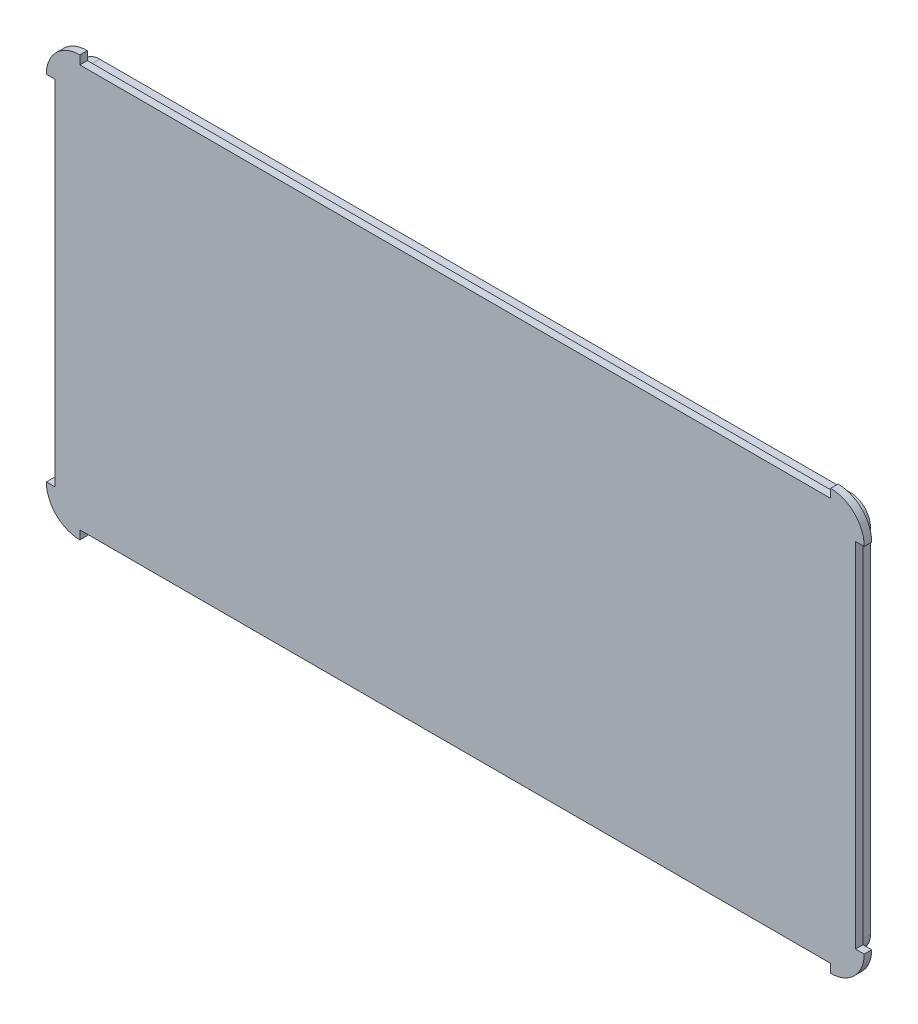
ISO-10303-21;
HEADER;
FILE_DESCRIPTION(('STEP AP214'),'2;1');
FILE_NAME('part.step','',(''),(''),'','','');
FILE_SCHEMA(('AUTOMOTIVE_DESIGN { 1 0 10303 214 1 1 1 1 }'));
ENDSEC;
DATA;
#1=APPLICATION_CONTEXT('core data for automotive mechanical design processes');
#2=APPLICATION_PROTOCOL_DEFINITION('international standard','automotive_design',2000,#1);
#3=PRODUCT_CONTEXT('',#1,'mechanical');
#4=PRODUCT('Part','Part','',(#3));
#5=PRODUCT_RELATED_PRODUCT_CATEGORY('part','',(#4));
#6=PRODUCT_DEFINITION_FORMATION('','',#4);
#7=PRODUCT_DEFINITION_CONTEXT('part definition',#1,'design');
#8=PRODUCT_DEFINITION('design','',#6,#7);
#9=PRODUCT_DEFINITION_SHAPE('','',#8);
#10=(LENGTH_UNIT() NAMED_UNIT(*) SI_UNIT(.MILLI.,.METRE.));
#11=(NAMED_UNIT(*) PLANE_ANGLE_UNIT() SI_UNIT($,.RADIAN.));
#12=(NAMED_UNIT(*) SI_UNIT($,.STERADIAN.) SOLID_ANGLE_UNIT());
#13=UNCERTAINTY_MEASURE_WITH_UNIT(LENGTH_MEASURE(1.E-05),#10,'distance_accuracy_value','');
#14=(GEOMETRIC_REPRESENTATION_CONTEXT(3) GLOBAL_UNCERTAINTY_ASSIGNED_CONTEXT((#13)) GLOBAL_UNIT_ASSIGNED_CONTEXT((#10,
#11,#12)) REPRESENTATION_CONTEXT('',''));
#15=CARTESIAN_POINT('',(0.,0.,0.));
#16=DIRECTION('',(0.,0.,1.));
#17=DIRECTION('',(1.,0.,0.));
#18=AXIS2_PLACEMENT_3D('',#15,#16,#17);
#19=CARTESIAN_POINT('',(151.,-71.,-3.));
#20=DIRECTION('',(0.,0.,1.));
#21=DIRECTION('',(1.,0.,0.));
#22=AXIS2_PLACEMENT_3D('',#19,#20,#21);
#23=PLANE('',#22);
#24=DIRECTION('',(1.,0.,0.));
#25=VECTOR('',#24,1.);
#26=CARTESIAN_POINT('',(-164.5,-70.9999999999999,-3.));
#27=LINE('',#26,#25);
#28=CARTESIAN_POINT('',(-164.5,-70.9999999999999,-3.));
#29=VERTEX_POINT('',#28);
#30=CARTESIAN_POINT('',(-161.,-70.9999999999999,-3.));
#31=VERTEX_POINT('',#30);
#32=EDGE_CURVE('E213',#29,#31,#27,.T.);
#33=ORIENTED_EDGE('',*,*,#32,.T.);
#34=DIRECTION('',(0.,-1.,0.));
#35=VECTOR('',#34,1.);
#36=CARTESIAN_POINT('',(-161.,70.9999999999999,-3.));
#37=LINE('',#36,#35);
#38=CARTESIAN_POINT('',(-161.,70.9999999999999,-3.));
#39=VERTEX_POINT('',#38);
#40=EDGE_CURVE('E356',#39,#31,#37,.T.);
#41=ORIENTED_EDGE('',*,*,#40,.F.);
#42=DIRECTION('',(-1.,0.,0.));
#43=VECTOR('',#42,1.);
#44=CARTESIAN_POINT('',(-164.5,70.9999999999999,-3.));
#45=LINE('',#44,#43);
#46=CARTESIAN_POINT('',(-164.5,70.9999999999999,-3.));
#47=VERTEX_POINT('',#46);
#48=EDGE_CURVE('E276',#39,#47,#45,.T.);
#49=ORIENTED_EDGE('',*,*,#48,.T.);
#50=CARTESIAN_POINT('',(-151.,71.,-3.));
#51=DIRECTION('',(0.,0.,1.));
#52=DIRECTION('',(1.,0.,0.));
#53=AXIS2_PLACEMENT_3D('',#50,#51,#52);
#54=CIRCLE('',#53,13.5000000000001);
#55=CARTESIAN_POINT('',(-151.,84.5,-3.));
#56=VERTEX_POINT('',#55);
#57=EDGE_CURVE('E273',#47,#56,#54,.F.);
#58=ORIENTED_EDGE('',*,*,#57,.T.);
#59=DIRECTION('',(0.,-1.,0.));
#60=VECTOR('',#59,1.);
#61=CARTESIAN_POINT('',(-151.,84.5,-3.));
#62=LINE('',#61,#60);
#63=CARTESIAN_POINT('',(-151.,81.,-3.));
#64=VERTEX_POINT('',#63);
#65=EDGE_CURVE('E270',#56,#64,#62,.T.);
#66=ORIENTED_EDGE('',*,*,#65,.T.);
#67=DIRECTION('',(-1.,0.,0.));
#68=VECTOR('',#67,1.);
#69=CARTESIAN_POINT('',(-151.,81.,-3.));
#70=LINE('',#69,#68);
#71=CARTESIAN_POINT('',(151.,81.,-3.));
#72=VERTEX_POINT('',#71);
#73=EDGE_CURVE('E352',#72,#64,#70,.T.);
#74=ORIENTED_EDGE('',*,*,#73,.F.);
#75=DIRECTION('',(0.,1.,0.));
#76=VECTOR('',#75,1.);
#77=CARTESIAN_POINT('',(151.,84.5,-3.));
#78=LINE('',#77,#76);
#79=CARTESIAN_POINT('',(151.,84.5,-3.));
#80=VERTEX_POINT('',#79);
#81=EDGE_CURVE('E250',#72,#80,#78,.T.);
#82=ORIENTED_EDGE('',*,*,#81,.T.);
#83=CARTESIAN_POINT('',(151.,71.,-3.));
#84=DIRECTION('',(0.,0.,1.));
#85=DIRECTION('',(1.,0.,0.));
#86=AXIS2_PLACEMENT_3D('',#83,#84,#85);
#87=CIRCLE('',#86,13.5000000000001);
#88=CARTESIAN_POINT('',(164.5,71.,-3.));
#89=VERTEX_POINT('',#88);
#90=EDGE_CURVE('E256',#80,#89,#87,.F.);
#91=ORIENTED_EDGE('',*,*,#90,.T.);
#92=DIRECTION('',(-1.,0.,0.));
#93=VECTOR('',#92,1.);
#94=CARTESIAN_POINT('',(164.5,71.,-3.));
#95=LINE('',#94,#93);
#96=CARTESIAN_POINT('',(161.,71.,-3.));
#97=VERTEX_POINT('',#96);
#98=EDGE_CURVE('E252',#89,#97,#95,.T.);
#99=ORIENTED_EDGE('',*,*,#98,.T.);
#100=DIRECTION('',(0.,1.,0.));
#101=VECTOR('',#100,1.);
#102=CARTESIAN_POINT('',(161.,71.,-3.));
#103=LINE('',#102,#101);
#104=CARTESIAN_POINT('',(161.,-71.,-3.));
#105=VERTEX_POINT('',#104);
#106=EDGE_CURVE('E349',#105,#97,#103,.T.);
#107=ORIENTED_EDGE('',*,*,#106,.F.);
#108=DIRECTION('',(1.,0.,0.));
#109=VECTOR('',#108,1.);
#110=CARTESIAN_POINT('',(164.5,-71.,-3.));
#111=LINE('',#110,#109);
#112=CARTESIAN_POINT('',(164.5,-71.,-3.));
#113=VERTEX_POINT('',#112);
#114=EDGE_CURVE('E230',#105,#113,#111,.T.);
#115=ORIENTED_EDGE('',*,*,#114,.T.);
#116=CARTESIAN_POINT('',(151.,-71.,-3.));
#117=DIRECTION('',(0.,0.,1.));
#118=DIRECTION('',(1.,0.,0.));
#119=AXIS2_PLACEMENT_3D('',#116,#117,#118);
#120=CIRCLE('',#119,13.5000000000001);
#121=CARTESIAN_POINT('',(151.,-84.5000000000001,-3.));
#122=VERTEX_POINT('',#121);
#123=EDGE_CURVE('E236',#113,#122,#120,.F.);
#124=ORIENTED_EDGE('',*,*,#123,.T.);
#125=DIRECTION('',(0.,1.,0.));
#126=VECTOR('',#125,1.);
#127=CARTESIAN_POINT('',(151.,-84.5,-3.));
#128=LINE('',#127,#126);
#129=CARTESIAN_POINT('',(151.,-81.0000000000001,-3.));
#130=VERTEX_POINT('',#129);
#131=EDGE_CURVE('E232',#122,#130,#128,.T.);
#132=ORIENTED_EDGE('',*,*,#131,.T.);
#133=DIRECTION('',(1.,0.,0.));
#134=VECTOR('',#133,1.);
#135=CARTESIAN_POINT('',(-151.,-81.,-3.));
#136=LINE('',#135,#134);
#137=CARTESIAN_POINT('',(-151.,-81.,-3.));
#138=VERTEX_POINT('',#137);
#139=EDGE_CURVE('E359',#138,#130,#136,.T.);
#140=ORIENTED_EDGE('',*,*,#139,.F.);
#141=DIRECTION('',(0.,-1.,0.));
#142=VECTOR('',#141,1.);
#143=CARTESIAN_POINT('',(-151.,-84.5,-3.));
#144=LINE('',#143,#142);
#145=CARTESIAN_POINT('',(-151.,-84.5,-3.));
#146=VERTEX_POINT('',#145);
#147=EDGE_CURVE('E225',#138,#146,#144,.T.);
#148=ORIENTED_EDGE('',*,*,#147,.T.);
#149=CARTESIAN_POINT('',(-151.,-71.,-3.));
#150=DIRECTION('',(0.,0.,1.));
#151=DIRECTION('',(1.,0.,0.));
#152=AXIS2_PLACEMENT_3D('',#149,#150,#151);
#153=CIRCLE('',#152,13.5000000000001);
#154=EDGE_CURVE('E227',#146,#29,#153,.F.);
#155=ORIENTED_EDGE('',*,*,#154,.T.);
#156=EDGE_LOOP('',(#33,#41,#49,#58,#66,#74,#82,#91,#99,#107,#115,#124,#132,#140,#148,#155));
#157=FACE_BOUND('',#156,.T.);
#158=DIRECTION('',(0.,1.,0.));
#159=VECTOR('',#158,1.);
#160=CARTESIAN_POINT('',(-159.,-71.,-3.));
#161=LINE('',#160,#159);
#162=CARTESIAN_POINT('',(-159.,-71.,-3.));
#163=VERTEX_POINT('',#162);
#164=CARTESIAN_POINT('',(-159.,70.9999999999999,-3.));
#165=VERTEX_POINT('',#164);
#166=EDGE_CURVE('E307',#163,#165,#161,.T.);
#167=ORIENTED_EDGE('',*,*,#166,.F.);
#168=CARTESIAN_POINT('',(-151.,-71.,-3.));
#169=DIRECTION('',(0.,0.,-1.));
#170=DIRECTION('',(-1.,0.,0.));
#171=AXIS2_PLACEMENT_3D('',#168,#169,#170);
#172=CIRCLE('',#171,8.00000000000001);
#173=CARTESIAN_POINT('',(-151.,-79.,-3.));
#174=VERTEX_POINT('',#173);
#175=EDGE_CURVE('E52',#174,#163,#172,.T.);
#176=ORIENTED_EDGE('',*,*,#175,.F.);
#177=DIRECTION('',(-1.,0.,0.));
#178=VECTOR('',#177,1.);
#179=CARTESIAN_POINT('',(151.,-79.,-3.));
#180=LINE('',#179,#178);
#181=CARTESIAN_POINT('',(151.,-79.,-3.));
#182=VERTEX_POINT('',#181);
#183=EDGE_CURVE('E56',#182,#174,#180,.T.);
#184=ORIENTED_EDGE('',*,*,#183,.F.);
#185=CARTESIAN_POINT('',(151.,-71.,-3.));
#186=DIRECTION('',(0.,0.,-1.));
#187=DIRECTION('',(-1.,0.,0.));
#188=AXIS2_PLACEMENT_3D('',#185,#186,#187);
#189=CIRCLE('',#188,8.00000000000006);
#190=CARTESIAN_POINT('',(159.,-71.,-3.));
#191=VERTEX_POINT('',#190);
#192=EDGE_CURVE('E322',#191,#182,#189,.T.);
#193=ORIENTED_EDGE('',*,*,#192,.F.);
#194=DIRECTION('',(0.,-1.,0.));
#195=VECTOR('',#194,1.);
#196=CARTESIAN_POINT('',(159.,71.,-3.));
#197=LINE('',#196,#195);
#198=CARTESIAN_POINT('',(159.,71.,-3.));
#199=VERTEX_POINT('',#198);
#200=EDGE_CURVE('E319',#199,#191,#197,.T.);
#201=ORIENTED_EDGE('',*,*,#200,.F.);
#202=CARTESIAN_POINT('',(151.,71.,-3.));
#203=DIRECTION('',(0.,0.,-1.));
#204=DIRECTION('',(-1.,0.,0.));
#205=AXIS2_PLACEMENT_3D('',#202,#203,#204);
#206=CIRCLE('',#205,8.0000000000001);
#207=CARTESIAN_POINT('',(151.,79.0000000000001,-3.));
#208=VERTEX_POINT('',#207);
#209=EDGE_CURVE('E316',#208,#199,#206,.T.);
#210=ORIENTED_EDGE('',*,*,#209,.F.);
#211=DIRECTION('',(1.,0.,0.));
#212=VECTOR('',#211,1.);
#213=CARTESIAN_POINT('',(-151.,79.,-3.));
#214=LINE('',#213,#212);
#215=CARTESIAN_POINT('',(-151.,79.,-3.));
#216=VERTEX_POINT('',#215);
#217=EDGE_CURVE('E313',#216,#208,#214,.T.);
#218=ORIENTED_EDGE('',*,*,#217,.F.);
#219=CARTESIAN_POINT('',(-151.,70.9999999999999,-3.));
#220=DIRECTION('',(0.,0.,-1.));
#221=DIRECTION('',(-1.,0.,0.));
#222=AXIS2_PLACEMENT_3D('',#219,#220,#221);
#223=CIRCLE('',#222,8.00000000000002);
#224=EDGE_CURVE('E310',#165,#216,#223,.T.);
#225=ORIENTED_EDGE('',*,*,#224,.F.);
#226=EDGE_LOOP('',(#167,#176,#184,#193,#201,#210,#218,#225));
#227=FACE_BOUND('',#226,.T.);
#228=ADVANCED_FACE('F35',(#157,#227),#23,.F.);
#229=CARTESIAN_POINT('',(-151.,-81.,-3.));
#230=DIRECTION('',(0.,-1.,0.));
#231=DIRECTION('',(1.,0.,0.));
#232=AXIS2_PLACEMENT_3D('',#229,#230,#231);
#233=PLANE('',#232);
#234=DIRECTION('',(1.,0.,0.));
#235=VECTOR('',#234,1.);
#236=CARTESIAN_POINT('',(-151.,-81.,0.));
#237=LINE('',#236,#235);
#238=CARTESIAN_POINT('',(-151.,-81.,0.));
#239=VERTEX_POINT('',#238);
#240=CARTESIAN_POINT('',(151.,-81.0000000000001,0.));
#241=VERTEX_POINT('',#240);
#242=EDGE_CURVE('E353',#239,#241,#237,.T.);
#243=ORIENTED_EDGE('',*,*,#242,.F.);
#244=DIRECTION('',(0.,0.,1.));
#245=VECTOR('',#244,1.);
#246=CARTESIAN_POINT('',(-151.,-81.,-3.));
#247=LINE('',#246,#245);
#248=EDGE_CURVE('E44',#138,#239,#247,.T.);
#249=ORIENTED_EDGE('',*,*,#248,.F.);
#250=ORIENTED_EDGE('',*,*,#139,.T.);
#251=DIRECTION('',(0.,0.,1.));
#252=VECTOR('',#251,1.);
#253=CARTESIAN_POINT('',(151.,-81.0000000000001,-3.));
#254=LINE('',#253,#252);
#255=EDGE_CURVE('E11',#130,#241,#254,.T.);
#256=ORIENTED_EDGE('',*,*,#255,.T.);
#257=EDGE_LOOP('',(#243,#249,#250,#256));
#258=FACE_BOUND('',#257,.T.);
#259=ADVANCED_FACE('F402',(#258),#233,.T.);
#260=CARTESIAN_POINT('',(-161.,70.9999999999999,-3.));
#261=DIRECTION('',(-1.,0.,0.));
#262=DIRECTION('',(0.,-1.,0.));
#263=AXIS2_PLACEMENT_3D('',#260,#261,#262);
#264=PLANE('',#263);
#265=DIRECTION('',(0.,-1.,0.));
#266=VECTOR('',#265,1.);
#267=CARTESIAN_POINT('',(-161.,70.9999999999999,0.));
#268=LINE('',#267,#266);
#269=CARTESIAN_POINT('',(-161.,70.9999999999999,0.));
#270=VERTEX_POINT('',#269);
#271=CARTESIAN_POINT('',(-161.,-71.,0.));
#272=VERTEX_POINT('',#271);
#273=EDGE_CURVE('E204',#270,#272,#268,.T.);
#274=ORIENTED_EDGE('',*,*,#273,.F.);
#275=DIRECTION('',(0.,0.,1.));
#276=VECTOR('',#275,1.);
#277=CARTESIAN_POINT('',(-161.,70.9999999999999,-3.));
#278=LINE('',#277,#276);
#279=EDGE_CURVE('E372',#39,#270,#278,.T.);
#280=ORIENTED_EDGE('',*,*,#279,.F.);
#281=ORIENTED_EDGE('',*,*,#40,.T.);
#282=DIRECTION('',(0.,0.,1.));
#283=VECTOR('',#282,1.);
#284=CARTESIAN_POINT('',(-161.,-71.,-3.));
#285=LINE('',#284,#283);
#286=EDGE_CURVE('E370',#31,#272,#285,.T.);
#287=ORIENTED_EDGE('',*,*,#286,.T.);
#288=EDGE_LOOP('',(#274,#280,#281,#287));
#289=FACE_BOUND('',#288,.T.);
#290=ADVANCED_FACE('F410',(#289),#264,.T.);
#291=CARTESIAN_POINT('',(-151.,81.,-3.));
#292=DIRECTION('',(0.,1.,0.));
#293=DIRECTION('',(-1.,0.,0.));
#294=AXIS2_PLACEMENT_3D('',#291,#292,#293);
#295=PLANE('',#294);
#296=DIRECTION('',(-1.,0.,0.));
#297=VECTOR('',#296,1.);
#298=CARTESIAN_POINT('',(-151.,81.,0.));
#299=LINE('',#298,#297);
#300=CARTESIAN_POINT('',(151.,81.,0.));
#301=VERTEX_POINT('',#300);
#302=CARTESIAN_POINT('',(-151.,81.,0.));
#303=VERTEX_POINT('',#302);
#304=EDGE_CURVE('E363',#301,#303,#299,.T.);
#305=ORIENTED_EDGE('',*,*,#304,.F.);
#306=DIRECTION('',(0.,0.,1.));
#307=VECTOR('',#306,1.);
#308=CARTESIAN_POINT('',(151.,81.0000000000001,-3.));
#309=LINE('',#308,#307);
#310=EDGE_CURVE('E377',#72,#301,#309,.T.);
#311=ORIENTED_EDGE('',*,*,#310,.F.);
#312=ORIENTED_EDGE('',*,*,#73,.T.);
#313=DIRECTION('',(0.,0.,1.));
#314=VECTOR('',#313,1.);
#315=CARTESIAN_POINT('',(-151.,81.,-3.));
#316=LINE('',#315,#314);
#317=EDGE_CURVE('E374',#64,#303,#316,.T.);
#318=ORIENTED_EDGE('',*,*,#317,.T.);
#319=EDGE_LOOP('',(#305,#311,#312,#318));
#320=FACE_BOUND('',#319,.T.);
#321=ADVANCED_FACE('F426',(#320),#295,.T.);
#322=CARTESIAN_POINT('',(161.,71.,-3.));
#323=DIRECTION('',(1.,0.,0.));
#324=DIRECTION('',(0.,0.,-1.));
#325=AXIS2_PLACEMENT_3D('',#322,#323,#324);
#326=PLANE('',#325);
#327=DIRECTION('',(0.,1.,0.));
#328=VECTOR('',#327,1.);
#329=CARTESIAN_POINT('',(161.,71.,0.));
#330=LINE('',#329,#328);
#331=CARTESIAN_POINT('',(161.,-71.,0.));
#332=VERTEX_POINT('',#331);
#333=CARTESIAN_POINT('',(161.,71.,0.));
#334=VERTEX_POINT('',#333);
#335=EDGE_CURVE('E348',#332,#334,#330,.T.);
#336=ORIENTED_EDGE('',*,*,#335,.F.);
#337=DIRECTION('',(0.,0.,1.));
#338=VECTOR('',#337,1.);
#339=CARTESIAN_POINT('',(161.,-71.,-3.));
#340=LINE('',#339,#338);
#341=EDGE_CURVE('E39',#105,#332,#340,.T.);
#342=ORIENTED_EDGE('',*,*,#341,.F.);
#343=ORIENTED_EDGE('',*,*,#106,.T.);
#344=DIRECTION('',(0.,0.,1.));
#345=VECTOR('',#344,1.);
#346=CARTESIAN_POINT('',(161.,71.,-3.));
#347=LINE('',#346,#345);
#348=EDGE_CURVE('E378',#97,#334,#347,.T.);
#349=ORIENTED_EDGE('',*,*,#348,.T.);
#350=EDGE_LOOP('',(#336,#342,#343,#349));
#351=FACE_BOUND('',#350,.T.);
#352=ADVANCED_FACE('F37',(#351),#326,.T.);
#353=CARTESIAN_POINT('',(151.,-71.,0.));
#354=DIRECTION('',(0.,0.,1.));
#355=DIRECTION('',(1.,0.,0.));
#356=AXIS2_PLACEMENT_3D('',#353,#354,#355);
#357=PLANE('',#356);
#358=ORIENTED_EDGE('',*,*,#273,.T.);
#359=DIRECTION('',(-1.,0.,0.));
#360=VECTOR('',#359,1.);
#361=CARTESIAN_POINT('',(-164.5,-70.9999999999999,0.));
#362=LINE('',#361,#360);
#363=CARTESIAN_POINT('',(-164.5,-70.9999999999999,0.));
#364=VERTEX_POINT('',#363);
#365=EDGE_CURVE('E195',#272,#364,#362,.T.);
#366=ORIENTED_EDGE('',*,*,#365,.T.);
#367=CARTESIAN_POINT('',(-151.,-71.,0.));
#368=DIRECTION('',(0.,0.,1.));
#369=DIRECTION('',(1.,0.,0.));
#370=AXIS2_PLACEMENT_3D('',#367,#368,#369);
#371=CIRCLE('',#370,13.5000000000001);
#372=CARTESIAN_POINT('',(-151.,-84.5,0.));
#373=VERTEX_POINT('',#372);
#374=EDGE_CURVE('E200',#364,#373,#371,.T.);
#375=ORIENTED_EDGE('',*,*,#374,.T.);
#376=DIRECTION('',(0.,1.,0.));
#377=VECTOR('',#376,1.);
#378=CARTESIAN_POINT('',(-151.,-84.5,0.));
#379=LINE('',#378,#377);
#380=EDGE_CURVE('E217',#373,#239,#379,.T.);
#381=ORIENTED_EDGE('',*,*,#380,.T.);
#382=ORIENTED_EDGE('',*,*,#242,.T.);
#383=DIRECTION('',(0.,-1.,0.));
#384=VECTOR('',#383,1.);
#385=CARTESIAN_POINT('',(151.,-84.5,0.));
#386=LINE('',#385,#384);
#387=CARTESIAN_POINT('',(151.,-84.5000000000001,0.));
#388=VERTEX_POINT('',#387);
#389=EDGE_CURVE('E229',#241,#388,#386,.T.);
#390=ORIENTED_EDGE('',*,*,#389,.T.);
#391=CARTESIAN_POINT('',(151.,-71.,0.));
#392=DIRECTION('',(0.,0.,1.));
#393=DIRECTION('',(-1.,0.,0.));
#394=AXIS2_PLACEMENT_3D('',#391,#392,#393);
#395=CIRCLE('',#394,13.5000000000001);
#396=CARTESIAN_POINT('',(164.5,-71.,0.));
#397=VERTEX_POINT('',#396);
#398=EDGE_CURVE('E238',#388,#397,#395,.T.);
#399=ORIENTED_EDGE('',*,*,#398,.T.);
#400=DIRECTION('',(-1.,0.,0.));
#401=VECTOR('',#400,1.);
#402=CARTESIAN_POINT('',(164.5,-71.,0.));
#403=LINE('',#402,#401);
#404=EDGE_CURVE('E241',#397,#332,#403,.T.);
#405=ORIENTED_EDGE('',*,*,#404,.T.);
#406=ORIENTED_EDGE('',*,*,#335,.T.);
#407=DIRECTION('',(1.,0.,0.));
#408=VECTOR('',#407,1.);
#409=CARTESIAN_POINT('',(164.5,71.,0.));
#410=LINE('',#409,#408);
#411=CARTESIAN_POINT('',(164.5,71.,0.));
#412=VERTEX_POINT('',#411);
#413=EDGE_CURVE('E249',#334,#412,#410,.T.);
#414=ORIENTED_EDGE('',*,*,#413,.T.);
#415=CARTESIAN_POINT('',(151.,71.,0.));
#416=DIRECTION('',(0.,0.,1.));
#417=DIRECTION('',(1.,0.,0.));
#418=AXIS2_PLACEMENT_3D('',#415,#416,#417);
#419=CIRCLE('',#418,13.5000000000001);
#420=CARTESIAN_POINT('',(151.,84.5,0.));
#421=VERTEX_POINT('',#420);
#422=EDGE_CURVE('E258',#412,#421,#419,.T.);
#423=ORIENTED_EDGE('',*,*,#422,.T.);
#424=DIRECTION('',(0.,-1.,0.));
#425=VECTOR('',#424,1.);
#426=CARTESIAN_POINT('',(151.,84.5,0.));
#427=LINE('',#426,#425);
#428=EDGE_CURVE('E261',#421,#301,#427,.T.);
#429=ORIENTED_EDGE('',*,*,#428,.T.);
#430=ORIENTED_EDGE('',*,*,#304,.T.);
#431=DIRECTION('',(0.,1.,0.));
#432=VECTOR('',#431,1.);
#433=CARTESIAN_POINT('',(-151.,84.5,0.));
#434=LINE('',#433,#432);
#435=CARTESIAN_POINT('',(-151.,84.5,0.));
#436=VERTEX_POINT('',#435);
#437=EDGE_CURVE('E281',#303,#436,#434,.T.);
#438=ORIENTED_EDGE('',*,*,#437,.T.);
#439=CARTESIAN_POINT('',(-151.,71.,0.));
#440=DIRECTION('',(0.,0.,1.));
#441=DIRECTION('',(-1.,0.,0.));
#442=AXIS2_PLACEMENT_3D('',#439,#440,#441);
#443=CIRCLE('',#442,13.5000000000001);
#444=CARTESIAN_POINT('',(-164.5,70.9999999999999,0.));
#445=VERTEX_POINT('',#444);
#446=EDGE_CURVE('E269',#436,#445,#443,.T.);
#447=ORIENTED_EDGE('',*,*,#446,.T.);
#448=DIRECTION('',(1.,0.,0.));
#449=VECTOR('',#448,1.);
#450=CARTESIAN_POINT('',(-164.5,70.9999999999999,0.));
#451=LINE('',#450,#449);
#452=EDGE_CURVE('E279',#445,#270,#451,.T.);
#453=ORIENTED_EDGE('',*,*,#452,.T.);
#454=EDGE_LOOP('',(#358,#366,#375,#381,#382,#390,#399,#405,#406,#414,#423,#429,#430,#438,#447,#453));
#455=FACE_BOUND('',#454,.T.);
#456=ADVANCED_FACE('F197',(#455),#357,.T.);
#457=CARTESIAN_POINT('',(-151.,-71.,-8.));
#458=DIRECTION('',(0.,0.,1.));
#459=DIRECTION('',(1.,0.,0.));
#460=AXIS2_PLACEMENT_3D('',#457,#458,#459);
#461=CYLINDRICAL_SURFACE('',#460,8.00000000000001);
#462=ORIENTED_EDGE('',*,*,#175,.T.);
#463=DIRECTION('',(0.,0.,1.));
#464=VECTOR('',#463,1.);
#465=CARTESIAN_POINT('',(-159.,-71.,-8.));
#466=LINE('',#465,#464);
#467=CARTESIAN_POINT('',(-159.,-71.,-8.));
#468=VERTEX_POINT('',#467);
#469=EDGE_CURVE('E345',#468,#163,#466,.T.);
#470=ORIENTED_EDGE('',*,*,#469,.F.);
#471=CARTESIAN_POINT('',(-151.,-71.,-8.));
#472=DIRECTION('',(0.,0.,-1.));
#473=DIRECTION('',(-1.,0.,0.));
#474=AXIS2_PLACEMENT_3D('',#471,#472,#473);
#475=CIRCLE('',#474,8.00000000000001);
#476=CARTESIAN_POINT('',(-151.,-79.,-8.));
#477=VERTEX_POINT('',#476);
#478=EDGE_CURVE('E288',#477,#468,#475,.T.);
#479=ORIENTED_EDGE('',*,*,#478,.F.);
#480=DIRECTION('',(0.,0.,1.));
#481=VECTOR('',#480,1.);
#482=CARTESIAN_POINT('',(-151.,-79.,-8.));
#483=LINE('',#482,#481);
#484=EDGE_CURVE('E305',#477,#174,#483,.T.);
#485=ORIENTED_EDGE('',*,*,#484,.T.);
#486=EDGE_LOOP('',(#462,#470,#479,#485));
#487=FACE_BOUND('',#486,.T.);
#488=ADVANCED_FACE('F459',(#487),#461,.T.);
#489=CARTESIAN_POINT('',(-159.,-71.,-8.));
#490=DIRECTION('',(1.,0.,0.));
#491=DIRECTION('',(0.,1.,0.));
#492=AXIS2_PLACEMENT_3D('',#489,#490,#491);
#493=PLANE('',#492);
#494=ORIENTED_EDGE('',*,*,#166,.T.);
#495=DIRECTION('',(0.,0.,1.));
#496=VECTOR('',#495,1.);
#497=CARTESIAN_POINT('',(-159.,70.9999999999999,-8.));
#498=LINE('',#497,#496);
#499=CARTESIAN_POINT('',(-159.,70.9999999999999,-8.));
#500=VERTEX_POINT('',#499);
#501=EDGE_CURVE('E342',#500,#165,#498,.T.);
#502=ORIENTED_EDGE('',*,*,#501,.F.);
#503=DIRECTION('',(0.,1.,0.));
#504=VECTOR('',#503,1.);
#505=CARTESIAN_POINT('',(-159.,-71.,-8.));
#506=LINE('',#505,#504);
#507=EDGE_CURVE('E291',#468,#500,#506,.T.);
#508=ORIENTED_EDGE('',*,*,#507,.F.);
#509=ORIENTED_EDGE('',*,*,#469,.T.);
#510=EDGE_LOOP('',(#494,#502,#508,#509));
#511=FACE_BOUND('',#510,.T.);
#512=ADVANCED_FACE('F592',(#511),#493,.F.);
#513=CARTESIAN_POINT('',(-151.,70.9999999999999,-8.));
#514=DIRECTION('',(0.,0.,1.));
#515=DIRECTION('',(1.,0.,0.));
#516=AXIS2_PLACEMENT_3D('',#513,#514,#515);
#517=CYLINDRICAL_SURFACE('',#516,8.00000000000002);
#518=ORIENTED_EDGE('',*,*,#224,.T.);
#519=DIRECTION('',(0.,0.,1.));
#520=VECTOR('',#519,1.);
#521=CARTESIAN_POINT('',(-151.,79.,-8.));
#522=LINE('',#521,#520);
#523=CARTESIAN_POINT('',(-151.,79.,-8.));
#524=VERTEX_POINT('',#523);
#525=EDGE_CURVE('E339',#524,#216,#522,.T.);
#526=ORIENTED_EDGE('',*,*,#525,.F.);
#527=CARTESIAN_POINT('',(-151.,70.9999999999999,-8.));
#528=DIRECTION('',(0.,0.,-1.));
#529=DIRECTION('',(-1.,0.,0.));
#530=AXIS2_PLACEMENT_3D('',#527,#528,#529);
#531=CIRCLE('',#530,8.00000000000002);
#532=EDGE_CURVE('E293',#500,#524,#531,.T.);
#533=ORIENTED_EDGE('',*,*,#532,.F.);
#534=ORIENTED_EDGE('',*,*,#501,.T.);
#535=EDGE_LOOP('',(#518,#526,#533,#534));
#536=FACE_BOUND('',#535,.T.);
#537=ADVANCED_FACE('F589',(#536),#517,.T.);
#538=CARTESIAN_POINT('',(-151.,79.,-8.));
#539=DIRECTION('',(0.,-1.,0.));
#540=DIRECTION('',(1.,0.,0.));
#541=AXIS2_PLACEMENT_3D('',#538,#539,#540);
#542=PLANE('',#541);
#543=ORIENTED_EDGE('',*,*,#217,.T.);
#544=DIRECTION('',(0.,0.,1.));
#545=VECTOR('',#544,1.);
#546=CARTESIAN_POINT('',(151.,79.0000000000001,-8.));
#547=LINE('',#546,#545);
#548=CARTESIAN_POINT('',(151.,79.0000000000001,-8.));
#549=VERTEX_POINT('',#548);
#550=EDGE_CURVE('E336',#549,#208,#547,.T.);
#551=ORIENTED_EDGE('',*,*,#550,.F.);
#552=DIRECTION('',(1.,0.,0.));
#553=VECTOR('',#552,1.);
#554=CARTESIAN_POINT('',(-151.,79.,-8.));
#555=LINE('',#554,#553);
#556=EDGE_CURVE('E295',#524,#549,#555,.T.);
#557=ORIENTED_EDGE('',*,*,#556,.F.);
#558=ORIENTED_EDGE('',*,*,#525,.T.);
#559=EDGE_LOOP('',(#543,#551,#557,#558));
#560=FACE_BOUND('',#559,.T.);
#561=ADVANCED_FACE('F585',(#560),#542,.F.);
#562=CARTESIAN_POINT('',(151.,71.,-8.));
#563=DIRECTION('',(0.,0.,1.));
#564=DIRECTION('',(1.,0.,0.));
#565=AXIS2_PLACEMENT_3D('',#562,#563,#564);
#566=CYLINDRICAL_SURFACE('',#565,8.0000000000001);
#567=ORIENTED_EDGE('',*,*,#209,.T.);
#568=DIRECTION('',(0.,0.,1.));
#569=VECTOR('',#568,1.);
#570=CARTESIAN_POINT('',(159.,71.,-8.));
#571=LINE('',#570,#569);
#572=CARTESIAN_POINT('',(159.,71.,-8.));
#573=VERTEX_POINT('',#572);
#574=EDGE_CURVE('E333',#573,#199,#571,.T.);
#575=ORIENTED_EDGE('',*,*,#574,.F.);
#576=CARTESIAN_POINT('',(151.,71.,-8.));
#577=DIRECTION('',(0.,0.,-1.));
#578=DIRECTION('',(-1.,0.,0.));
#579=AXIS2_PLACEMENT_3D('',#576,#577,#578);
#580=CIRCLE('',#579,8.0000000000001);
#581=EDGE_CURVE('E297',#549,#573,#580,.T.);
#582=ORIENTED_EDGE('',*,*,#581,.F.);
#583=ORIENTED_EDGE('',*,*,#550,.T.);
#584=EDGE_LOOP('',(#567,#575,#582,#583));
#585=FACE_BOUND('',#584,.T.);
#586=ADVANCED_FACE('F581',(#585),#566,.T.);
#587=CARTESIAN_POINT('',(159.,71.,-8.));
#588=DIRECTION('',(-1.,0.,0.));
#589=DIRECTION('',(0.,-1.,0.));
#590=AXIS2_PLACEMENT_3D('',#587,#588,#589);
#591=PLANE('',#590);
#592=ORIENTED_EDGE('',*,*,#200,.T.);
#593=DIRECTION('',(0.,0.,1.));
#594=VECTOR('',#593,1.);
#595=CARTESIAN_POINT('',(159.,-71.,-8.));
#596=LINE('',#595,#594);
#597=CARTESIAN_POINT('',(159.,-71.,-8.));
#598=VERTEX_POINT('',#597);
#599=EDGE_CURVE('E330',#598,#191,#596,.T.);
#600=ORIENTED_EDGE('',*,*,#599,.F.);
#601=DIRECTION('',(0.,-1.,0.));
#602=VECTOR('',#601,1.);
#603=CARTESIAN_POINT('',(159.,71.,-8.));
#604=LINE('',#603,#602);
#605=EDGE_CURVE('E299',#573,#598,#604,.T.);
#606=ORIENTED_EDGE('',*,*,#605,.F.);
#607=ORIENTED_EDGE('',*,*,#574,.T.);
#608=EDGE_LOOP('',(#592,#600,#606,#607));
#609=FACE_BOUND('',#608,.T.);
#610=ADVANCED_FACE('F577',(#609),#591,.F.);
#611=CARTESIAN_POINT('',(151.,-71.,-8.));
#612=DIRECTION('',(0.,0.,1.));
#613=DIRECTION('',(1.,0.,0.));
#614=AXIS2_PLACEMENT_3D('',#611,#612,#613);
#615=CYLINDRICAL_SURFACE('',#614,8.00000000000006);
#616=ORIENTED_EDGE('',*,*,#192,.T.);
#617=DIRECTION('',(0.,0.,1.));
#618=VECTOR('',#617,1.);
#619=CARTESIAN_POINT('',(151.,-79.,-8.));
#620=LINE('',#619,#618);
#621=CARTESIAN_POINT('',(151.,-79.,-8.));
#622=VERTEX_POINT('',#621);
#623=EDGE_CURVE('E327',#622,#182,#620,.T.);
#624=ORIENTED_EDGE('',*,*,#623,.F.);
#625=CARTESIAN_POINT('',(151.,-71.,-8.));
#626=DIRECTION('',(0.,0.,-1.));
#627=DIRECTION('',(-1.,0.,0.));
#628=AXIS2_PLACEMENT_3D('',#625,#626,#627);
#629=CIRCLE('',#628,8.00000000000006);
#630=EDGE_CURVE('E301',#598,#622,#629,.T.);
#631=ORIENTED_EDGE('',*,*,#630,.F.);
#632=ORIENTED_EDGE('',*,*,#599,.T.);
#633=EDGE_LOOP('',(#616,#624,#631,#632));
#634=FACE_BOUND('',#633,.T.);
#635=ADVANCED_FACE('F573',(#634),#615,.T.);
#636=CARTESIAN_POINT('',(151.,-79.,-8.));
#637=DIRECTION('',(0.,1.,0.));
#638=DIRECTION('',(0.,0.,1.));
#639=AXIS2_PLACEMENT_3D('',#636,#637,#638);
#640=PLANE('',#639);
#641=ORIENTED_EDGE('',*,*,#183,.T.);
#642=ORIENTED_EDGE('',*,*,#484,.F.);
#643=DIRECTION('',(-1.,0.,0.));
#644=VECTOR('',#643,1.);
#645=CARTESIAN_POINT('',(151.,-79.,-8.));
#646=LINE('',#645,#644);
#647=EDGE_CURVE('E303',#622,#477,#646,.T.);
#648=ORIENTED_EDGE('',*,*,#647,.F.);
#649=ORIENTED_EDGE('',*,*,#623,.T.);
#650=EDGE_LOOP('',(#641,#642,#648,#649));
#651=FACE_BOUND('',#650,.T.);
#652=ADVANCED_FACE('F569',(#651),#640,.F.);
#653=CARTESIAN_POINT('',(-151.,-71.,-8.));
#654=DIRECTION('',(0.,0.,-1.));
#655=DIRECTION('',(-1.,0.,0.));
#656=AXIS2_PLACEMENT_3D('',#653,#654,#655);
#657=PLANE('',#656);
#658=ORIENTED_EDGE('',*,*,#478,.T.);
#659=ORIENTED_EDGE('',*,*,#507,.T.);
#660=ORIENTED_EDGE('',*,*,#532,.T.);
#661=ORIENTED_EDGE('',*,*,#556,.T.);
#662=ORIENTED_EDGE('',*,*,#581,.T.);
#663=ORIENTED_EDGE('',*,*,#605,.T.);
#664=ORIENTED_EDGE('',*,*,#630,.T.);
#665=ORIENTED_EDGE('',*,*,#647,.T.);
#666=EDGE_LOOP('',(#658,#659,#660,#661,#662,#663,#664,#665));
#667=FACE_BOUND('',#666,.T.);
#668=ADVANCED_FACE('F484',(#667),#657,.T.);
#669=CARTESIAN_POINT('',(-151.,71.,-22.0918830920369));
#670=DIRECTION('',(0.,0.,1.));
#671=DIRECTION('',(1.,0.,0.));
#672=AXIS2_PLACEMENT_3D('',#669,#670,#671);
#673=CYLINDRICAL_SURFACE('',#672,13.5000000000001);
#674=ORIENTED_EDGE('',*,*,#57,.F.);
#675=DIRECTION('',(0.,0.,1.));
#676=VECTOR('',#675,1.);
#677=CARTESIAN_POINT('',(-164.5,70.9999999999999,-22.0918830920369));
#678=LINE('',#677,#676);
#679=EDGE_CURVE('E283',#47,#445,#678,.T.);
#680=ORIENTED_EDGE('',*,*,#679,.T.);
#681=ORIENTED_EDGE('',*,*,#446,.F.);
#682=DIRECTION('',(0.,0.,1.));
#683=VECTOR('',#682,1.);
#684=CARTESIAN_POINT('',(-151.,84.5,-22.0918830920369));
#685=LINE('',#684,#683);
#686=EDGE_CURVE('E274',#56,#436,#685,.T.);
#687=ORIENTED_EDGE('',*,*,#686,.F.);
#688=EDGE_LOOP('',(#674,#680,#681,#687));
#689=FACE_BOUND('',#688,.T.);
#690=ADVANCED_FACE('F419',(#689),#673,.T.);
#691=CARTESIAN_POINT('',(-151.,84.5,-22.0918830920369));
#692=DIRECTION('',(1.,0.,0.));
#693=DIRECTION('',(0.,1.,0.));
#694=AXIS2_PLACEMENT_3D('',#691,#692,#693);
#695=PLANE('',#694);
#696=ORIENTED_EDGE('',*,*,#437,.F.);
#697=ORIENTED_EDGE('',*,*,#317,.F.);
#698=ORIENTED_EDGE('',*,*,#65,.F.);
#699=ORIENTED_EDGE('',*,*,#686,.T.);
#700=EDGE_LOOP('',(#696,#697,#698,#699));
#701=FACE_BOUND('',#700,.T.);
#702=ADVANCED_FACE('F423',(#701),#695,.T.);
#703=CARTESIAN_POINT('',(-164.5,70.9999999999999,-22.0918830920369));
#704=DIRECTION('',(0.,-1.,0.));
#705=DIRECTION('',(0.,0.,-1.));
#706=AXIS2_PLACEMENT_3D('',#703,#704,#705);
#707=PLANE('',#706);
#708=ORIENTED_EDGE('',*,*,#48,.F.);
#709=ORIENTED_EDGE('',*,*,#279,.T.);
#710=ORIENTED_EDGE('',*,*,#452,.F.);
#711=ORIENTED_EDGE('',*,*,#679,.F.);
#712=EDGE_LOOP('',(#708,#709,#710,#711));
#713=FACE_BOUND('',#712,.T.);
#714=ADVANCED_FACE('F413',(#713),#707,.T.);
#715=CARTESIAN_POINT('',(164.5,71.,-22.0918830920369));
#716=DIRECTION('',(0.,-1.,0.));
#717=DIRECTION('',(1.,0.,0.));
#718=AXIS2_PLACEMENT_3D('',#715,#716,#717);
#719=PLANE('',#718);
#720=ORIENTED_EDGE('',*,*,#413,.F.);
#721=ORIENTED_EDGE('',*,*,#348,.F.);
#722=ORIENTED_EDGE('',*,*,#98,.F.);
#723=DIRECTION('',(0.,0.,1.));
#724=VECTOR('',#723,1.);
#725=CARTESIAN_POINT('',(164.5,71.,-22.0918830920369));
#726=LINE('',#725,#724);
#727=EDGE_CURVE('E264',#89,#412,#726,.T.);
#728=ORIENTED_EDGE('',*,*,#727,.T.);
#729=EDGE_LOOP('',(#720,#721,#722,#728));
#730=FACE_BOUND('',#729,.T.);
#731=ADVANCED_FACE('F438',(#730),#719,.T.);
#732=CARTESIAN_POINT('',(151.,84.5,-22.0918830920369));
#733=DIRECTION('',(-1.,0.,0.));
#734=DIRECTION('',(0.,-1.,0.));
#735=AXIS2_PLACEMENT_3D('',#732,#733,#734);
#736=PLANE('',#735);
#737=ORIENTED_EDGE('',*,*,#81,.F.);
#738=ORIENTED_EDGE('',*,*,#310,.T.);
#739=ORIENTED_EDGE('',*,*,#428,.F.);
#740=DIRECTION('',(0.,0.,1.));
#741=VECTOR('',#740,1.);
#742=CARTESIAN_POINT('',(151.,84.5,-22.0918830920369));
#743=LINE('',#742,#741);
#744=EDGE_CURVE('E253',#80,#421,#743,.T.);
#745=ORIENTED_EDGE('',*,*,#744,.F.);
#746=EDGE_LOOP('',(#737,#738,#739,#745));
#747=FACE_BOUND('',#746,.T.);
#748=ADVANCED_FACE('F432',(#747),#736,.T.);
#749=CARTESIAN_POINT('',(151.,71.,-22.0918830920369));
#750=DIRECTION('',(0.,0.,1.));
#751=DIRECTION('',(1.,0.,0.));
#752=AXIS2_PLACEMENT_3D('',#749,#750,#751);
#753=CYLINDRICAL_SURFACE('',#752,13.5000000000001);
#754=ORIENTED_EDGE('',*,*,#90,.F.);
#755=ORIENTED_EDGE('',*,*,#744,.T.);
#756=ORIENTED_EDGE('',*,*,#422,.F.);
#757=ORIENTED_EDGE('',*,*,#727,.F.);
#758=EDGE_LOOP('',(#754,#755,#756,#757));
#759=FACE_BOUND('',#758,.T.);
#760=ADVANCED_FACE('F439',(#759),#753,.T.);
#761=CARTESIAN_POINT('',(151.,-84.5,-22.0918830920369));
#762=DIRECTION('',(-1.,0.,0.));
#763=DIRECTION('',(0.,-1.,0.));
#764=AXIS2_PLACEMENT_3D('',#761,#762,#763);
#765=PLANE('',#764);
#766=ORIENTED_EDGE('',*,*,#389,.F.);
#767=ORIENTED_EDGE('',*,*,#255,.F.);
#768=ORIENTED_EDGE('',*,*,#131,.F.);
#769=DIRECTION('',(0.,0.,1.));
#770=VECTOR('',#769,1.);
#771=CARTESIAN_POINT('',(151.,-84.5000000000001,-22.0918830920369));
#772=LINE('',#771,#770);
#773=EDGE_CURVE('E244',#122,#388,#772,.T.);
#774=ORIENTED_EDGE('',*,*,#773,.T.);
#775=EDGE_LOOP('',(#766,#767,#768,#774));
#776=FACE_BOUND('',#775,.T.);
#777=ADVANCED_FACE('F399',(#776),#765,.T.);
#778=CARTESIAN_POINT('',(164.5,-71.,-22.0918830920369));
#779=DIRECTION('',(0.,1.,0.));
#780=DIRECTION('',(-1.,0.,0.));
#781=AXIS2_PLACEMENT_3D('',#778,#779,#780);
#782=PLANE('',#781);
#783=ORIENTED_EDGE('',*,*,#114,.F.);
#784=ORIENTED_EDGE('',*,*,#341,.T.);
#785=ORIENTED_EDGE('',*,*,#404,.F.);
#786=DIRECTION('',(0.,0.,1.));
#787=VECTOR('',#786,1.);
#788=CARTESIAN_POINT('',(164.5,-71.,-22.0918830920369));
#789=LINE('',#788,#787);
#790=EDGE_CURVE('E233',#113,#397,#789,.T.);
#791=ORIENTED_EDGE('',*,*,#790,.F.);
#792=EDGE_LOOP('',(#783,#784,#785,#791));
#793=FACE_BOUND('',#792,.T.);
#794=ADVANCED_FACE('F385',(#793),#782,.T.);
#795=CARTESIAN_POINT('',(151.,-71.,-22.0918830920369));
#796=DIRECTION('',(0.,0.,1.));
#797=DIRECTION('',(1.,0.,0.));
#798=AXIS2_PLACEMENT_3D('',#795,#796,#797);
#799=CYLINDRICAL_SURFACE('',#798,13.5000000000001);
#800=ORIENTED_EDGE('',*,*,#123,.F.);
#801=ORIENTED_EDGE('',*,*,#790,.T.);
#802=ORIENTED_EDGE('',*,*,#398,.F.);
#803=ORIENTED_EDGE('',*,*,#773,.F.);
#804=EDGE_LOOP('',(#800,#801,#802,#803));
#805=FACE_BOUND('',#804,.T.);
#806=ADVANCED_FACE('F393',(#805),#799,.T.);
#807=CARTESIAN_POINT('',(-164.5,-70.9999999999999,-22.0918830920369));
#808=DIRECTION('',(0.,1.,0.));
#809=DIRECTION('',(-1.,0.,0.));
#810=AXIS2_PLACEMENT_3D('',#807,#808,#809);
#811=PLANE('',#810);
#812=ORIENTED_EDGE('',*,*,#365,.F.);
#813=ORIENTED_EDGE('',*,*,#286,.F.);
#814=ORIENTED_EDGE('',*,*,#32,.F.);
#815=DIRECTION('',(0.,0.,1.));
#816=VECTOR('',#815,1.);
#817=CARTESIAN_POINT('',(-164.5,-70.9999999999999,-22.0918830920369));
#818=LINE('',#817,#816);
#819=EDGE_CURVE('E210',#29,#364,#818,.T.);
#820=ORIENTED_EDGE('',*,*,#819,.T.);
#821=EDGE_LOOP('',(#812,#813,#814,#820));
#822=FACE_BOUND('',#821,.T.);
#823=ADVANCED_FACE('F211',(#822),#811,.T.);
#824=CARTESIAN_POINT('',(-151.,-84.5,-22.0918830920369));
#825=DIRECTION('',(1.,0.,0.));
#826=DIRECTION('',(0.,1.,0.));
#827=AXIS2_PLACEMENT_3D('',#824,#825,#826);
#828=PLANE('',#827);
#829=ORIENTED_EDGE('',*,*,#147,.F.);
#830=ORIENTED_EDGE('',*,*,#248,.T.);
#831=ORIENTED_EDGE('',*,*,#380,.F.);
#832=DIRECTION('',(0.,0.,1.));
#833=VECTOR('',#832,1.);
#834=CARTESIAN_POINT('',(-151.,-84.5,-22.0918830920369));
#835=LINE('',#834,#833);
#836=EDGE_CURVE('E216',#146,#373,#835,.T.);
#837=ORIENTED_EDGE('',*,*,#836,.F.);
#838=EDGE_LOOP('',(#829,#830,#831,#837));
#839=FACE_BOUND('',#838,.T.);
#840=ADVANCED_FACE('F405',(#839),#828,.T.);
#841=CARTESIAN_POINT('',(-151.,-71.,-22.0918830920369));
#842=DIRECTION('',(0.,0.,1.));
#843=DIRECTION('',(1.,0.,0.));
#844=AXIS2_PLACEMENT_3D('',#841,#842,#843);
#845=CYLINDRICAL_SURFACE('',#844,13.5000000000001);
#846=ORIENTED_EDGE('',*,*,#154,.F.);
#847=ORIENTED_EDGE('',*,*,#836,.T.);
#848=ORIENTED_EDGE('',*,*,#374,.F.);
#849=ORIENTED_EDGE('',*,*,#819,.F.);
#850=EDGE_LOOP('',(#846,#847,#848,#849));
#851=FACE_BOUND('',#850,.T.);
#852=ADVANCED_FACE('F219',(#851),#845,.T.);
#853=CLOSED_SHELL('',(#228,#259,#290,#321,#352,#456,#488,#512,#537,#561,#586,#610,#635,#652,
#668,#690,#702,#714,#731,#748,#760,#777,#794,#806,#823,#840,#852));
#854=MANIFOLD_SOLID_BREP('B2',#853);
#855=ADVANCED_BREP_SHAPE_REPRESENTATION('',(#18,#854),#14);
#856=SHAPE_DEFINITION_REPRESENTATION(#9,#855);
ENDSEC;
END-ISO-10303-21;
